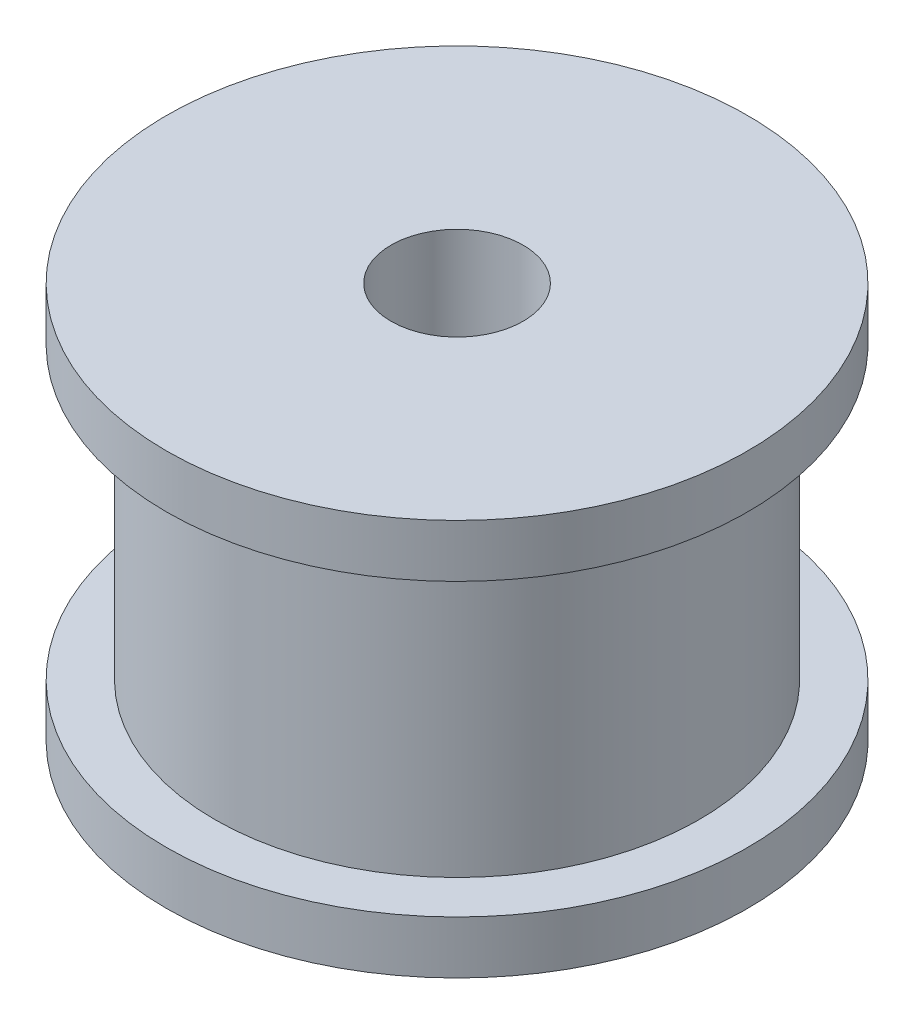
ISO-10303-21;
HEADER;
FILE_DESCRIPTION(('STEP AP214'),'2;1');
FILE_NAME('part.step','',(''),(''),'','','');
FILE_SCHEMA(('AUTOMOTIVE_DESIGN { 1 0 10303 214 1 1 1 1 }'));
ENDSEC;
DATA;
#1=APPLICATION_CONTEXT('core data for automotive mechanical design processes');
#2=APPLICATION_PROTOCOL_DEFINITION('international standard','automotive_design',2000,#1);
#3=PRODUCT_CONTEXT('',#1,'mechanical');
#4=PRODUCT('Part','Part','',(#3));
#5=PRODUCT_RELATED_PRODUCT_CATEGORY('part','',(#4));
#6=PRODUCT_DEFINITION_FORMATION('','',#4);
#7=PRODUCT_DEFINITION_CONTEXT('part definition',#1,'design');
#8=PRODUCT_DEFINITION('design','',#6,#7);
#9=PRODUCT_DEFINITION_SHAPE('','',#8);
#10=(LENGTH_UNIT() NAMED_UNIT(*) SI_UNIT(.MILLI.,.METRE.));
#11=(NAMED_UNIT(*) PLANE_ANGLE_UNIT() SI_UNIT($,.RADIAN.));
#12=(NAMED_UNIT(*) SI_UNIT($,.STERADIAN.) SOLID_ANGLE_UNIT());
#13=UNCERTAINTY_MEASURE_WITH_UNIT(LENGTH_MEASURE(1.E-05),#10,'distance_accuracy_value','');
#14=(GEOMETRIC_REPRESENTATION_CONTEXT(3) GLOBAL_UNCERTAINTY_ASSIGNED_CONTEXT((#13)) GLOBAL_UNIT_ASSIGNED_CONTEXT((#10,
#11,#12)) REPRESENTATION_CONTEXT('',''));
#15=CARTESIAN_POINT('',(0.,0.,0.));
#16=DIRECTION('',(0.,0.,1.));
#17=DIRECTION('',(1.,0.,0.));
#18=AXIS2_PLACEMENT_3D('',#15,#16,#17);
#19=CARTESIAN_POINT('',(0.,2.,0.));
#20=DIRECTION('',(0.,-1.,0.));
#21=DIRECTION('',(0.,0.,-1.));
#22=AXIS2_PLACEMENT_3D('',#19,#20,#21);
#23=CYLINDRICAL_SURFACE('',#22,11.);
#24=CARTESIAN_POINT('',(0.,2.,0.));
#25=DIRECTION('',(0.,1.,0.));
#26=DIRECTION('',(0.,0.,1.));
#27=AXIS2_PLACEMENT_3D('',#24,#25,#26);
#28=CIRCLE('',#27,11.);
#29=CARTESIAN_POINT('',(0.,2.,11.));
#30=VERTEX_POINT('',#29);
#31=EDGE_CURVE('E49',#30,#30,#28,.T.);
#32=ORIENTED_EDGE('',*,*,#31,.F.);
#33=EDGE_LOOP('',(#32));
#34=FACE_BOUND('',#33,.T.);
#35=CARTESIAN_POINT('',(0.,0.,0.));
#36=DIRECTION('',(0.,1.,0.));
#37=DIRECTION('',(0.,0.,1.));
#38=AXIS2_PLACEMENT_3D('',#35,#36,#37);
#39=CIRCLE('',#38,11.);
#40=CARTESIAN_POINT('',(0.,0.,11.));
#41=VERTEX_POINT('',#40);
#42=EDGE_CURVE('E44',#41,#41,#39,.T.);
#43=ORIENTED_EDGE('',*,*,#42,.T.);
#44=EDGE_LOOP('',(#43));
#45=FACE_BOUND('',#44,.T.);
#46=ADVANCED_FACE('F41',(#34,#45),#23,.T.);
#47=CARTESIAN_POINT('',(0.,2.,0.));
#48=DIRECTION('',(0.,1.,0.));
#49=DIRECTION('',(0.,0.,1.));
#50=AXIS2_PLACEMENT_3D('',#47,#48,#49);
#51=PLANE('',#50);
#52=CARTESIAN_POINT('',(0.,2.,0.));
#53=DIRECTION('',(0.,1.,0.));
#54=DIRECTION('',(0.,0.,1.));
#55=AXIS2_PLACEMENT_3D('',#52,#53,#54);
#56=CIRCLE('',#55,9.17);
#57=CARTESIAN_POINT('',(0.,2.,9.17));
#58=VERTEX_POINT('',#57);
#59=EDGE_CURVE('E10',#58,#58,#56,.T.);
#60=ORIENTED_EDGE('',*,*,#59,.F.);
#61=EDGE_LOOP('',(#60));
#62=FACE_BOUND('',#61,.T.);
#63=ORIENTED_EDGE('',*,*,#31,.T.);
#64=EDGE_LOOP('',(#63));
#65=FACE_BOUND('',#64,.T.);
#66=ADVANCED_FACE('F102',(#62,#65),#51,.T.);
#67=CARTESIAN_POINT('',(0.,0.,0.));
#68=DIRECTION('',(0.,1.,0.));
#69=DIRECTION('',(0.,0.,1.));
#70=AXIS2_PLACEMENT_3D('',#67,#68,#69);
#71=PLANE('',#70);
#72=CARTESIAN_POINT('',(0.,0.,0.));
#73=DIRECTION('',(0.,1.,0.));
#74=DIRECTION('',(0.,0.,1.));
#75=AXIS2_PLACEMENT_3D('',#72,#73,#74);
#76=CIRCLE('',#75,2.5);
#77=CARTESIAN_POINT('',(0.,0.,2.5));
#78=VERTEX_POINT('',#77);
#79=EDGE_CURVE('E65',#78,#78,#76,.T.);
#80=ORIENTED_EDGE('',*,*,#79,.T.);
#81=EDGE_LOOP('',(#80));
#82=FACE_BOUND('',#81,.T.);
#83=ORIENTED_EDGE('',*,*,#42,.F.);
#84=EDGE_LOOP('',(#83));
#85=FACE_BOUND('',#84,.T.);
#86=ADVANCED_FACE('F107',(#82,#85),#71,.F.);
#87=CARTESIAN_POINT('',(0.,13.,0.));
#88=DIRECTION('',(0.,-1.,0.));
#89=DIRECTION('',(0.,0.,-1.));
#90=AXIS2_PLACEMENT_3D('',#87,#88,#89);
#91=CYLINDRICAL_SURFACE('',#90,9.17);
#92=CARTESIAN_POINT('',(0.,13.,0.));
#93=DIRECTION('',(0.,1.,0.));
#94=DIRECTION('',(0.,0.,1.));
#95=AXIS2_PLACEMENT_3D('',#92,#93,#94);
#96=CIRCLE('',#95,9.17);
#97=CARTESIAN_POINT('',(0.,13.,9.17));
#98=VERTEX_POINT('',#97);
#99=EDGE_CURVE('E56',#98,#98,#96,.T.);
#100=ORIENTED_EDGE('',*,*,#99,.F.);
#101=EDGE_LOOP('',(#100));
#102=FACE_BOUND('',#101,.T.);
#103=ORIENTED_EDGE('',*,*,#59,.T.);
#104=EDGE_LOOP('',(#103));
#105=FACE_BOUND('',#104,.T.);
#106=ADVANCED_FACE('F90',(#102,#105),#91,.T.);
#107=CARTESIAN_POINT('',(0.,15.,0.));
#108=DIRECTION('',(0.,-1.,0.));
#109=DIRECTION('',(0.,0.,-1.));
#110=AXIS2_PLACEMENT_3D('',#107,#108,#109);
#111=CYLINDRICAL_SURFACE('',#110,11.);
#112=CARTESIAN_POINT('',(0.,15.,0.));
#113=DIRECTION('',(0.,1.,0.));
#114=DIRECTION('',(0.,0.,1.));
#115=AXIS2_PLACEMENT_3D('',#112,#113,#114);
#116=CIRCLE('',#115,11.);
#117=CARTESIAN_POINT('',(0.,15.,11.));
#118=VERTEX_POINT('',#117);
#119=EDGE_CURVE('E60',#118,#118,#116,.T.);
#120=ORIENTED_EDGE('',*,*,#119,.F.);
#121=EDGE_LOOP('',(#120));
#122=FACE_BOUND('',#121,.T.);
#123=CARTESIAN_POINT('',(0.,13.,0.));
#124=DIRECTION('',(0.,1.,0.));
#125=DIRECTION('',(0.,0.,1.));
#126=AXIS2_PLACEMENT_3D('',#123,#124,#125);
#127=CIRCLE('',#126,11.);
#128=CARTESIAN_POINT('',(0.,13.,11.));
#129=VERTEX_POINT('',#128);
#130=EDGE_CURVE('E61',#129,#129,#127,.T.);
#131=ORIENTED_EDGE('',*,*,#130,.T.);
#132=EDGE_LOOP('',(#131));
#133=FACE_BOUND('',#132,.T.);
#134=ADVANCED_FACE('F84',(#122,#133),#111,.T.);
#135=CARTESIAN_POINT('',(0.,15.,0.));
#136=DIRECTION('',(0.,1.,0.));
#137=DIRECTION('',(0.,0.,1.));
#138=AXIS2_PLACEMENT_3D('',#135,#136,#137);
#139=PLANE('',#138);
#140=CARTESIAN_POINT('',(0.,15.,0.));
#141=DIRECTION('',(0.,1.,0.));
#142=DIRECTION('',(0.,0.,1.));
#143=AXIS2_PLACEMENT_3D('',#140,#141,#142);
#144=CIRCLE('',#143,2.5);
#145=CARTESIAN_POINT('',(0.,15.,2.5));
#146=VERTEX_POINT('',#145);
#147=EDGE_CURVE('E72',#146,#146,#144,.T.);
#148=ORIENTED_EDGE('',*,*,#147,.F.);
#149=EDGE_LOOP('',(#148));
#150=FACE_BOUND('',#149,.T.);
#151=ORIENTED_EDGE('',*,*,#119,.T.);
#152=EDGE_LOOP('',(#151));
#153=FACE_BOUND('',#152,.T.);
#154=ADVANCED_FACE('F80',(#150,#153),#139,.T.);
#155=CARTESIAN_POINT('',(0.,13.,0.));
#156=DIRECTION('',(0.,1.,0.));
#157=DIRECTION('',(0.,0.,1.));
#158=AXIS2_PLACEMENT_3D('',#155,#156,#157);
#159=PLANE('',#158);
#160=ORIENTED_EDGE('',*,*,#99,.T.);
#161=EDGE_LOOP('',(#160));
#162=FACE_BOUND('',#161,.T.);
#163=ORIENTED_EDGE('',*,*,#130,.F.);
#164=EDGE_LOOP('',(#163));
#165=FACE_BOUND('',#164,.T.);
#166=ADVANCED_FACE('F83',(#162,#165),#159,.F.);
#167=CARTESIAN_POINT('',(0.,-11.,0.));
#168=DIRECTION('',(0.,1.,0.));
#169=DIRECTION('',(0.,0.,1.));
#170=AXIS2_PLACEMENT_3D('',#167,#168,#169);
#171=CYLINDRICAL_SURFACE('',#170,2.5);
#172=CARTESIAN_POINT('',(0.,15.,2.5));
#173=CARTESIAN_POINT('',(0.,14.84375,2.5));
#174=CARTESIAN_POINT('',(0.,14.6875,2.5));
#175=CARTESIAN_POINT('',(0.,14.375,2.5));
#176=CARTESIAN_POINT('',(0.,14.21875,2.5));
#177=CARTESIAN_POINT('',(0.,13.90625,2.5));
#178=CARTESIAN_POINT('',(0.,13.75,2.5));
#179=CARTESIAN_POINT('',(0.,13.4375,2.5));
#180=CARTESIAN_POINT('',(0.,13.28125,2.5));
#181=CARTESIAN_POINT('',(0.,12.96875,2.5));
#182=CARTESIAN_POINT('',(0.,12.8125,2.5));
#183=CARTESIAN_POINT('',(0.,12.5,2.5));
#184=CARTESIAN_POINT('',(0.,12.34375,2.5));
#185=CARTESIAN_POINT('',(0.,12.03125,2.5));
#186=CARTESIAN_POINT('',(0.,11.875,2.5));
#187=CARTESIAN_POINT('',(0.,11.5625,2.5));
#188=CARTESIAN_POINT('',(0.,11.40625,2.5));
#189=CARTESIAN_POINT('',(0.,11.09375,2.5));
#190=CARTESIAN_POINT('',(0.,10.9375,2.5));
#191=CARTESIAN_POINT('',(0.,10.625,2.5));
#192=CARTESIAN_POINT('',(0.,10.46875,2.5));
#193=CARTESIAN_POINT('',(0.,10.15625,2.5));
#194=CARTESIAN_POINT('',(0.,10.,2.5));
#195=CARTESIAN_POINT('',(0.,9.6875,2.5));
#196=CARTESIAN_POINT('',(0.,9.53125,2.5));
#197=CARTESIAN_POINT('',(0.,9.21875,2.5));
#198=CARTESIAN_POINT('',(0.,9.0625,2.5));
#199=CARTESIAN_POINT('',(0.,8.75,2.5));
#200=CARTESIAN_POINT('',(0.,8.59375,2.5));
#201=CARTESIAN_POINT('',(0.,8.28125,2.5));
#202=CARTESIAN_POINT('',(0.,8.125,2.5));
#203=CARTESIAN_POINT('',(0.,7.8125,2.5));
#204=CARTESIAN_POINT('',(0.,7.65625,2.5));
#205=CARTESIAN_POINT('',(0.,7.34375,2.5));
#206=CARTESIAN_POINT('',(0.,7.1875,2.5));
#207=CARTESIAN_POINT('',(0.,6.875,2.5));
#208=CARTESIAN_POINT('',(0.,6.71875,2.5));
#209=CARTESIAN_POINT('',(0.,6.40625,2.5));
#210=CARTESIAN_POINT('',(0.,6.25,2.5));
#211=CARTESIAN_POINT('',(0.,5.9375,2.5));
#212=CARTESIAN_POINT('',(0.,5.78125,2.5));
#213=CARTESIAN_POINT('',(0.,5.46875,2.5));
#214=CARTESIAN_POINT('',(0.,5.3125,2.5));
#215=CARTESIAN_POINT('',(0.,5.,2.5));
#216=CARTESIAN_POINT('',(0.,4.84375,2.5));
#217=CARTESIAN_POINT('',(0.,4.53125,2.5));
#218=CARTESIAN_POINT('',(0.,4.375,2.5));
#219=CARTESIAN_POINT('',(0.,4.0625,2.5));
#220=CARTESIAN_POINT('',(0.,3.90625,2.5));
#221=CARTESIAN_POINT('',(0.,3.59375,2.5));
#222=CARTESIAN_POINT('',(0.,3.4375,2.5));
#223=CARTESIAN_POINT('',(0.,3.125,2.5));
#224=CARTESIAN_POINT('',(0.,2.96875,2.5));
#225=CARTESIAN_POINT('',(0.,2.65625,2.5));
#226=CARTESIAN_POINT('',(0.,2.5,2.5));
#227=CARTESIAN_POINT('',(0.,2.1875,2.5));
#228=CARTESIAN_POINT('',(0.,2.03125,2.5));
#229=CARTESIAN_POINT('',(0.,1.71875,2.5));
#230=CARTESIAN_POINT('',(0.,1.5625,2.5));
#231=CARTESIAN_POINT('',(0.,1.25,2.5));
#232=CARTESIAN_POINT('',(0.,1.09375,2.5));
#233=CARTESIAN_POINT('',(0.,0.781249999999999,2.5));
#234=CARTESIAN_POINT('',(0.,0.624999999999999,2.5));
#235=CARTESIAN_POINT('',(0.,0.312499999999999,2.5));
#236=CARTESIAN_POINT('',(0.,0.156249999999998,2.5));
#237=CARTESIAN_POINT('',(0.,0.,2.5));
#238=B_SPLINE_CURVE_WITH_KNOTS('',3,(#172,#173,#174,#175,#176,#177,#178,#179,#180,#181,#182,
#183,#184,#185,#186,#187,#188,#189,#190,#191,#192,#193,#194,#195,#196,#197,#198,#199,#200,#201,
#202,#203,#204,#205,#206,#207,#208,#209,#210,#211,#212,#213,#214,#215,#216,#217,#218,#219,#220,
#221,#222,#223,#224,#225,#226,#227,#228,#229,#230,#231,#232,#233,#234,#235,#236,#237),
.UNSPECIFIED.,.F.,.F.,(4,2,2,2,2,2,2,2,2,2,2,2,2,2,2,2,2,2,2,2,2,2,2,2,2,2,2,2,2,2,2,2,4),(0.,
0.46875,0.937500000000001,1.40625,1.875,2.34375,2.8125,3.28125,3.75,4.21875,4.6875,5.15625,
5.625,6.09375,6.5625,7.03125,7.5,7.96875,8.4375,8.90625,9.375,9.84375,10.3125,10.78125,11.25,
11.71875,12.1875,12.65625,13.125,13.59375,14.0625,14.53125,15.),.UNSPECIFIED.);
#239=EDGE_CURVE('BSEAM77',#146,#78,#238,.T.);
#240=ORIENTED_EDGE('',*,*,#147,.T.);
#241=ORIENTED_EDGE('',*,*,#79,.F.);
#242=ORIENTED_EDGE('',*,*,#239,.T.);
#243=ORIENTED_EDGE('',*,*,#239,.F.);
#244=EDGE_LOOP('',(#240,#242,#241,#243));
#245=FACE_BOUND('',#244,.T.);
#246=ADVANCED_FACE('F77',(#245),#171,.F.);
#247=CLOSED_SHELL('',(#46,#66,#86,#106,#134,#154,#166,#246));
#248=MANIFOLD_SOLID_BREP('B2',#247);
#249=ADVANCED_BREP_SHAPE_REPRESENTATION('',(#18,#248),#14);
#250=SHAPE_DEFINITION_REPRESENTATION(#9,#249);
ENDSEC;
END-ISO-10303-21;
